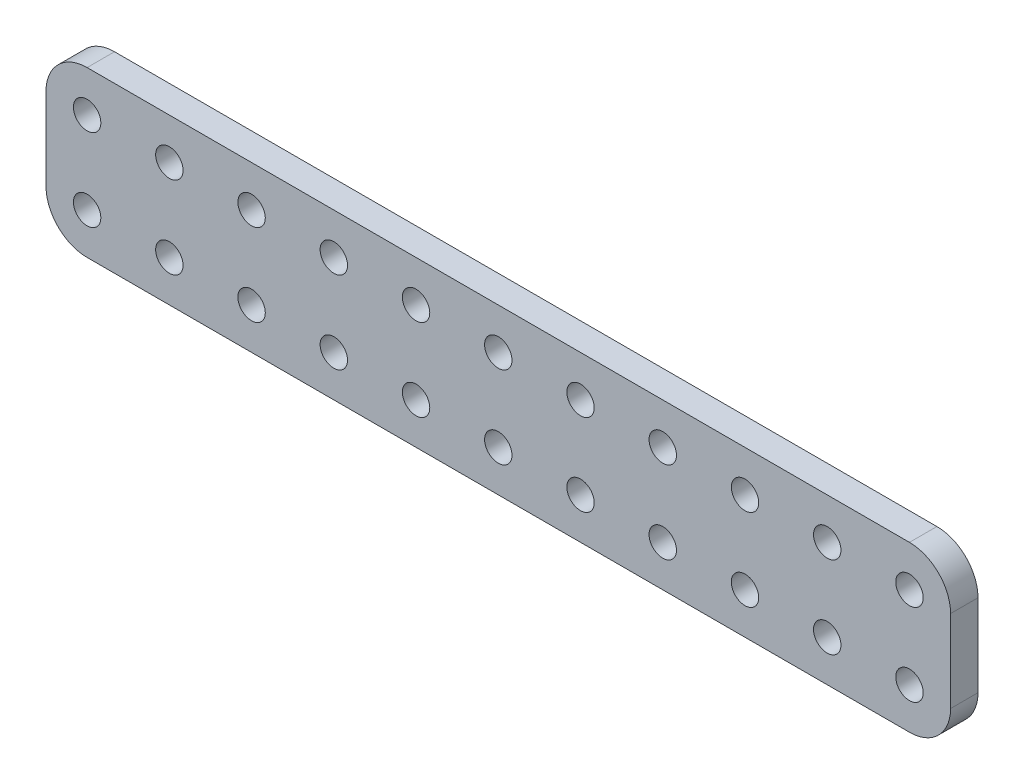
ISO-10303-21;
HEADER;
FILE_DESCRIPTION(('STEP AP214'),'2;1');
FILE_NAME('part.step','',(''),(''),'','','');
FILE_SCHEMA(('AUTOMOTIVE_DESIGN { 1 0 10303 214 1 1 1 1 }'));
ENDSEC;
DATA;
#1=APPLICATION_CONTEXT('core data for automotive mechanical design processes');
#2=APPLICATION_PROTOCOL_DEFINITION('international standard','automotive_design',2000,#1);
#3=PRODUCT_CONTEXT('',#1,'mechanical');
#4=PRODUCT('Part','Part','',(#3));
#5=PRODUCT_RELATED_PRODUCT_CATEGORY('part','',(#4));
#6=PRODUCT_DEFINITION_FORMATION('','',#4);
#7=PRODUCT_DEFINITION_CONTEXT('part definition',#1,'design');
#8=PRODUCT_DEFINITION('design','',#6,#7);
#9=PRODUCT_DEFINITION_SHAPE('','',#8);
#10=(LENGTH_UNIT() NAMED_UNIT(*) SI_UNIT(.MILLI.,.METRE.));
#11=(NAMED_UNIT(*) PLANE_ANGLE_UNIT() SI_UNIT($,.RADIAN.));
#12=(NAMED_UNIT(*) SI_UNIT($,.STERADIAN.) SOLID_ANGLE_UNIT());
#13=UNCERTAINTY_MEASURE_WITH_UNIT(LENGTH_MEASURE(1.E-05),#10,'distance_accuracy_value','');
#14=(GEOMETRIC_REPRESENTATION_CONTEXT(3) GLOBAL_UNCERTAINTY_ASSIGNED_CONTEXT((#13)) GLOBAL_UNIT_ASSIGNED_CONTEXT((#10,
#11,#12)) REPRESENTATION_CONTEXT('',''));
#15=CARTESIAN_POINT('',(0.,0.,0.));
#16=DIRECTION('',(0.,0.,1.));
#17=DIRECTION('',(1.,0.,0.));
#18=AXIS2_PLACEMENT_3D('',#15,#16,#17);
#19=CARTESIAN_POINT('',(346.4291313108,224.2422436139,3.));
#20=DIRECTION('',(0.,0.,1.));
#21=DIRECTION('',(1.,0.,0.));
#22=AXIS2_PLACEMENT_3D('',#19,#20,#21);
#23=PLANE('',#22);
#24=CARTESIAN_POINT('',(328.4291313108,224.2422436139,3.));
#25=DIRECTION('',(0.,0.,1.));
#26=DIRECTION('',(1.,0.,0.));
#27=AXIS2_PLACEMENT_3D('',#24,#25,#26);
#28=CIRCLE('',#27,1.5);
#29=CARTESIAN_POINT('',(329.9291313108,224.2422436139,3.));
#30=VERTEX_POINT('',#29);
#31=EDGE_CURVE('E296',#30,#30,#28,.T.);
#32=ORIENTED_EDGE('',*,*,#31,.F.);
#33=EDGE_LOOP('',(#32));
#34=FACE_BOUND('',#33,.T.);
#35=CARTESIAN_POINT('',(337.4291313108,224.2422436139,3.));
#36=DIRECTION('',(0.,0.,1.));
#37=DIRECTION('',(1.,0.,0.));
#38=AXIS2_PLACEMENT_3D('',#35,#36,#37);
#39=CIRCLE('',#38,1.5);
#40=CARTESIAN_POINT('',(338.9291313108,224.2422436139,3.));
#41=VERTEX_POINT('',#40);
#42=EDGE_CURVE('E284',#41,#41,#39,.T.);
#43=ORIENTED_EDGE('',*,*,#42,.F.);
#44=EDGE_LOOP('',(#43));
#45=FACE_BOUND('',#44,.T.);
#46=CARTESIAN_POINT('',(256.4291313108,224.2422436139,3.));
#47=DIRECTION('',(0.,0.,1.));
#48=DIRECTION('',(1.,0.,0.));
#49=AXIS2_PLACEMENT_3D('',#46,#47,#48);
#50=CIRCLE('',#49,1.50000000000006);
#51=CARTESIAN_POINT('',(257.9291313108,224.2422436139,3.));
#52=VERTEX_POINT('',#51);
#53=EDGE_CURVE('E272',#52,#52,#50,.T.);
#54=ORIENTED_EDGE('',*,*,#53,.F.);
#55=EDGE_LOOP('',(#54));
#56=FACE_BOUND('',#55,.T.);
#57=CARTESIAN_POINT('',(274.4291313108,224.2422436139,3.));
#58=DIRECTION('',(0.,0.,1.));
#59=DIRECTION('',(1.,0.,0.));
#60=AXIS2_PLACEMENT_3D('',#57,#58,#59);
#61=CIRCLE('',#60,1.5);
#62=CARTESIAN_POINT('',(275.9291313108,224.2422436139,3.));
#63=VERTEX_POINT('',#62);
#64=EDGE_CURVE('E260',#63,#63,#61,.T.);
#65=ORIENTED_EDGE('',*,*,#64,.F.);
#66=EDGE_LOOP('',(#65));
#67=FACE_BOUND('',#66,.T.);
#68=CARTESIAN_POINT('',(256.4291313108,215.2422436139,3.));
#69=DIRECTION('',(0.,0.,1.));
#70=DIRECTION('',(1.,0.,0.));
#71=AXIS2_PLACEMENT_3D('',#68,#69,#70);
#72=CIRCLE('',#71,1.49999999999983);
#73=CARTESIAN_POINT('',(257.9291313108,215.2422436139,3.));
#74=VERTEX_POINT('',#73);
#75=EDGE_CURVE('E248',#74,#74,#72,.T.);
#76=ORIENTED_EDGE('',*,*,#75,.F.);
#77=EDGE_LOOP('',(#76));
#78=FACE_BOUND('',#77,.T.);
#79=CARTESIAN_POINT('',(283.4291313108,215.2422436139,3.));
#80=DIRECTION('',(0.,0.,1.));
#81=DIRECTION('',(1.,0.,0.));
#82=AXIS2_PLACEMENT_3D('',#79,#80,#81);
#83=CIRCLE('',#82,1.5);
#84=CARTESIAN_POINT('',(284.9291313108,215.2422436139,3.));
#85=VERTEX_POINT('',#84);
#86=EDGE_CURVE('E236',#85,#85,#83,.T.);
#87=ORIENTED_EDGE('',*,*,#86,.F.);
#88=EDGE_LOOP('',(#87));
#89=FACE_BOUND('',#88,.T.);
#90=CARTESIAN_POINT('',(301.4291313108,215.2422436139,3.));
#91=DIRECTION('',(0.,0.,1.));
#92=DIRECTION('',(1.,0.,0.));
#93=AXIS2_PLACEMENT_3D('',#90,#91,#92);
#94=CIRCLE('',#93,1.5);
#95=CARTESIAN_POINT('',(302.9291313108,215.2422436139,3.));
#96=VERTEX_POINT('',#95);
#97=EDGE_CURVE('E224',#96,#96,#94,.T.);
#98=ORIENTED_EDGE('',*,*,#97,.F.);
#99=EDGE_LOOP('',(#98));
#100=FACE_BOUND('',#99,.T.);
#101=CARTESIAN_POINT('',(310.4291313108,215.2422436139,3.));
#102=DIRECTION('',(0.,0.,1.));
#103=DIRECTION('',(1.,0.,0.));
#104=AXIS2_PLACEMENT_3D('',#101,#102,#103);
#105=CIRCLE('',#104,1.5);
#106=CARTESIAN_POINT('',(311.9291313108,215.2422436139,3.));
#107=VERTEX_POINT('',#106);
#108=EDGE_CURVE('E212',#107,#107,#105,.T.);
#109=ORIENTED_EDGE('',*,*,#108,.F.);
#110=EDGE_LOOP('',(#109));
#111=FACE_BOUND('',#110,.T.);
#112=CARTESIAN_POINT('',(319.4291313108,215.2422436139,3.));
#113=DIRECTION('',(0.,0.,1.));
#114=DIRECTION('',(1.,0.,0.));
#115=AXIS2_PLACEMENT_3D('',#112,#113,#114);
#116=CIRCLE('',#115,1.5);
#117=CARTESIAN_POINT('',(320.9291313108,215.2422436139,3.));
#118=VERTEX_POINT('',#117);
#119=EDGE_CURVE('E200',#118,#118,#116,.T.);
#120=ORIENTED_EDGE('',*,*,#119,.F.);
#121=EDGE_LOOP('',(#120));
#122=FACE_BOUND('',#121,.T.);
#123=CARTESIAN_POINT('',(301.4291313108,224.2422436139,3.));
#124=DIRECTION('',(0.,0.,1.));
#125=DIRECTION('',(1.,0.,0.));
#126=AXIS2_PLACEMENT_3D('',#123,#124,#125);
#127=CIRCLE('',#126,1.5);
#128=CARTESIAN_POINT('',(302.9291313108,224.2422436139,3.));
#129=VERTEX_POINT('',#128);
#130=EDGE_CURVE('E188',#129,#129,#127,.T.);
#131=ORIENTED_EDGE('',*,*,#130,.F.);
#132=EDGE_LOOP('',(#131));
#133=FACE_BOUND('',#132,.T.);
#134=CARTESIAN_POINT('',(310.4291313108,224.2422436139,3.));
#135=DIRECTION('',(0.,0.,1.));
#136=DIRECTION('',(1.,0.,0.));
#137=AXIS2_PLACEMENT_3D('',#134,#135,#136);
#138=CIRCLE('',#137,1.5);
#139=CARTESIAN_POINT('',(311.9291313108,224.2422436139,3.));
#140=VERTEX_POINT('',#139);
#141=EDGE_CURVE('E134',#140,#140,#138,.T.);
#142=ORIENTED_EDGE('',*,*,#141,.F.);
#143=EDGE_LOOP('',(#142));
#144=FACE_BOUND('',#143,.T.);
#145=CARTESIAN_POINT('',(346.4291313108,224.2422436139,3.));
#146=DIRECTION('',(0.,0.,1.));
#147=DIRECTION('',(1.,0.,0.));
#148=AXIS2_PLACEMENT_3D('',#145,#146,#147);
#149=CIRCLE('',#148,4.5);
#150=CARTESIAN_POINT('',(350.9291313108,224.2422436139,3.));
#151=VERTEX_POINT('',#150);
#152=CARTESIAN_POINT('',(346.4291313108,228.7422436139,3.));
#153=VERTEX_POINT('',#152);
#154=EDGE_CURVE('E145',#151,#153,#149,.T.);
#155=ORIENTED_EDGE('',*,*,#154,.T.);
#156=DIRECTION('',(-1.,0.,0.));
#157=VECTOR('',#156,1.);
#158=CARTESIAN_POINT('',(256.4291313108,228.7422436139,3.));
#159=LINE('',#158,#157);
#160=CARTESIAN_POINT('',(256.4291313108,228.7422436139,3.));
#161=VERTEX_POINT('',#160);
#162=EDGE_CURVE('E93',#153,#161,#159,.T.);
#163=ORIENTED_EDGE('',*,*,#162,.T.);
#164=CARTESIAN_POINT('',(256.4291313108,224.2422436139,3.));
#165=DIRECTION('',(0.,0.,1.));
#166=DIRECTION('',(1.,0.,0.));
#167=AXIS2_PLACEMENT_3D('',#164,#165,#166);
#168=CIRCLE('',#167,4.5);
#169=CARTESIAN_POINT('',(251.9291313108,224.2422436139,3.));
#170=VERTEX_POINT('',#169);
#171=EDGE_CURVE('E160',#161,#170,#168,.T.);
#172=ORIENTED_EDGE('',*,*,#171,.T.);
#173=DIRECTION('',(0.,-1.,0.));
#174=VECTOR('',#173,1.);
#175=CARTESIAN_POINT('',(251.9291313108,224.2422436139,3.));
#176=LINE('',#175,#174);
#177=CARTESIAN_POINT('',(251.9291313108,215.2422436139,3.));
#178=VERTEX_POINT('',#177);
#179=EDGE_CURVE('E173',#170,#178,#176,.T.);
#180=ORIENTED_EDGE('',*,*,#179,.T.);
#181=CARTESIAN_POINT('',(256.4291313108,215.2422436139,3.));
#182=DIRECTION('',(0.,0.,1.));
#183=DIRECTION('',(1.,0.,0.));
#184=AXIS2_PLACEMENT_3D('',#181,#182,#183);
#185=CIRCLE('',#184,4.50000000000023);
#186=CARTESIAN_POINT('',(256.4291313108,210.7422436139,3.));
#187=VERTEX_POINT('',#186);
#188=EDGE_CURVE('E112',#178,#187,#185,.T.);
#189=ORIENTED_EDGE('',*,*,#188,.T.);
#190=DIRECTION('',(1.,0.,0.));
#191=VECTOR('',#190,1.);
#192=CARTESIAN_POINT('',(346.4291313108,210.7422436139,3.));
#193=LINE('',#192,#191);
#194=CARTESIAN_POINT('',(346.4291313108,210.7422436139,3.));
#195=VERTEX_POINT('',#194);
#196=EDGE_CURVE('E106',#187,#195,#193,.T.);
#197=ORIENTED_EDGE('',*,*,#196,.T.);
#198=CARTESIAN_POINT('',(346.4291313108,215.2422436139,3.));
#199=DIRECTION('',(0.,0.,1.));
#200=DIRECTION('',(1.,0.,0.));
#201=AXIS2_PLACEMENT_3D('',#198,#199,#200);
#202=CIRCLE('',#201,4.5);
#203=CARTESIAN_POINT('',(350.9291313108,215.2422436139,3.));
#204=VERTEX_POINT('',#203);
#205=EDGE_CURVE('E110',#195,#204,#202,.T.);
#206=ORIENTED_EDGE('',*,*,#205,.T.);
#207=DIRECTION('',(0.,1.,0.));
#208=VECTOR('',#207,1.);
#209=CARTESIAN_POINT('',(350.9291313108,224.2422436139,3.));
#210=LINE('',#209,#208);
#211=EDGE_CURVE('E50',#204,#151,#210,.T.);
#212=ORIENTED_EDGE('',*,*,#211,.T.);
#213=EDGE_LOOP('',(#155,#163,#172,#180,#189,#197,#206,#212));
#214=FACE_BOUND('',#213,.T.);
#215=CARTESIAN_POINT('',(292.4291313108,224.2422436139,3.));
#216=DIRECTION('',(0.,0.,1.));
#217=DIRECTION('',(1.,0.,0.));
#218=AXIS2_PLACEMENT_3D('',#215,#216,#217);
#219=CIRCLE('',#218,1.5);
#220=CARTESIAN_POINT('',(293.9291313108,224.2422436139,3.));
#221=VERTEX_POINT('',#220);
#222=EDGE_CURVE('E182',#221,#221,#219,.T.);
#223=ORIENTED_EDGE('',*,*,#222,.F.);
#224=EDGE_LOOP('',(#223));
#225=FACE_BOUND('',#224,.T.);
#226=CARTESIAN_POINT('',(337.4291313108,215.2422436139,3.));
#227=DIRECTION('',(0.,0.,1.));
#228=DIRECTION('',(1.,0.,0.));
#229=AXIS2_PLACEMENT_3D('',#226,#227,#228);
#230=CIRCLE('',#229,1.5);
#231=CARTESIAN_POINT('',(338.9291313108,215.2422436139,3.));
#232=VERTEX_POINT('',#231);
#233=EDGE_CURVE('E194',#232,#232,#230,.T.);
#234=ORIENTED_EDGE('',*,*,#233,.F.);
#235=EDGE_LOOP('',(#234));
#236=FACE_BOUND('',#235,.T.);
#237=CARTESIAN_POINT('',(328.4291313108,215.2422436139,3.));
#238=DIRECTION('',(0.,0.,1.));
#239=DIRECTION('',(1.,0.,0.));
#240=AXIS2_PLACEMENT_3D('',#237,#238,#239);
#241=CIRCLE('',#240,1.5);
#242=CARTESIAN_POINT('',(329.9291313108,215.2422436139,3.));
#243=VERTEX_POINT('',#242);
#244=EDGE_CURVE('E206',#243,#243,#241,.T.);
#245=ORIENTED_EDGE('',*,*,#244,.F.);
#246=EDGE_LOOP('',(#245));
#247=FACE_BOUND('',#246,.T.);
#248=CARTESIAN_POINT('',(292.4291313108,215.2422436139,3.));
#249=DIRECTION('',(0.,0.,1.));
#250=DIRECTION('',(1.,0.,0.));
#251=AXIS2_PLACEMENT_3D('',#248,#249,#250);
#252=CIRCLE('',#251,1.5);
#253=CARTESIAN_POINT('',(293.9291313108,215.2422436139,3.));
#254=VERTEX_POINT('',#253);
#255=EDGE_CURVE('E218',#254,#254,#252,.T.);
#256=ORIENTED_EDGE('',*,*,#255,.F.);
#257=EDGE_LOOP('',(#256));
#258=FACE_BOUND('',#257,.T.);
#259=CARTESIAN_POINT('',(274.4291313108,215.2422436139,3.));
#260=DIRECTION('',(0.,0.,1.));
#261=DIRECTION('',(1.,0.,0.));
#262=AXIS2_PLACEMENT_3D('',#259,#260,#261);
#263=CIRCLE('',#262,1.5);
#264=CARTESIAN_POINT('',(275.9291313108,215.2422436139,3.));
#265=VERTEX_POINT('',#264);
#266=EDGE_CURVE('E230',#265,#265,#263,.T.);
#267=ORIENTED_EDGE('',*,*,#266,.F.);
#268=EDGE_LOOP('',(#267));
#269=FACE_BOUND('',#268,.T.);
#270=CARTESIAN_POINT('',(265.4291313108,215.2422436139,3.));
#271=DIRECTION('',(0.,0.,1.));
#272=DIRECTION('',(1.,0.,0.));
#273=AXIS2_PLACEMENT_3D('',#270,#271,#272);
#274=CIRCLE('',#273,1.5);
#275=CARTESIAN_POINT('',(266.9291313108,215.2422436139,3.));
#276=VERTEX_POINT('',#275);
#277=EDGE_CURVE('E242',#276,#276,#274,.T.);
#278=ORIENTED_EDGE('',*,*,#277,.F.);
#279=EDGE_LOOP('',(#278));
#280=FACE_BOUND('',#279,.T.);
#281=CARTESIAN_POINT('',(346.4291313108,215.2422436139,3.));
#282=DIRECTION('',(0.,0.,1.));
#283=DIRECTION('',(1.,0.,0.));
#284=AXIS2_PLACEMENT_3D('',#281,#282,#283);
#285=CIRCLE('',#284,1.5);
#286=CARTESIAN_POINT('',(347.9291313108,215.2422436139,3.));
#287=VERTEX_POINT('',#286);
#288=EDGE_CURVE('E254',#287,#287,#285,.T.);
#289=ORIENTED_EDGE('',*,*,#288,.F.);
#290=EDGE_LOOP('',(#289));
#291=FACE_BOUND('',#290,.T.);
#292=CARTESIAN_POINT('',(265.4291313108,224.2422436139,3.));
#293=DIRECTION('',(0.,0.,1.));
#294=DIRECTION('',(1.,0.,0.));
#295=AXIS2_PLACEMENT_3D('',#292,#293,#294);
#296=CIRCLE('',#295,1.5);
#297=CARTESIAN_POINT('',(266.9291313108,224.2422436139,3.));
#298=VERTEX_POINT('',#297);
#299=EDGE_CURVE('E266',#298,#298,#296,.T.);
#300=ORIENTED_EDGE('',*,*,#299,.F.);
#301=EDGE_LOOP('',(#300));
#302=FACE_BOUND('',#301,.T.);
#303=CARTESIAN_POINT('',(283.4291313108,224.2422436139,3.));
#304=DIRECTION('',(0.,0.,1.));
#305=DIRECTION('',(1.,0.,0.));
#306=AXIS2_PLACEMENT_3D('',#303,#304,#305);
#307=CIRCLE('',#306,1.5);
#308=CARTESIAN_POINT('',(284.9291313108,224.2422436139,3.));
#309=VERTEX_POINT('',#308);
#310=EDGE_CURVE('E278',#309,#309,#307,.T.);
#311=ORIENTED_EDGE('',*,*,#310,.F.);
#312=EDGE_LOOP('',(#311));
#313=FACE_BOUND('',#312,.T.);
#314=CARTESIAN_POINT('',(319.4291313108,224.2422436139,3.));
#315=DIRECTION('',(0.,0.,1.));
#316=DIRECTION('',(1.,0.,0.));
#317=AXIS2_PLACEMENT_3D('',#314,#315,#316);
#318=CIRCLE('',#317,1.5);
#319=CARTESIAN_POINT('',(320.9291313108,224.2422436139,3.));
#320=VERTEX_POINT('',#319);
#321=EDGE_CURVE('E290',#320,#320,#318,.T.);
#322=ORIENTED_EDGE('',*,*,#321,.F.);
#323=EDGE_LOOP('',(#322));
#324=FACE_BOUND('',#323,.T.);
#325=CARTESIAN_POINT('',(346.4291313108,224.2422436139,3.));
#326=DIRECTION('',(0.,0.,1.));
#327=DIRECTION('',(1.,0.,0.));
#328=AXIS2_PLACEMENT_3D('',#325,#326,#327);
#329=CIRCLE('',#328,1.5);
#330=CARTESIAN_POINT('',(347.9291313108,224.2422436139,3.));
#331=VERTEX_POINT('',#330);
#332=EDGE_CURVE('E302',#331,#331,#329,.T.);
#333=ORIENTED_EDGE('',*,*,#332,.F.);
#334=EDGE_LOOP('',(#333));
#335=FACE_BOUND('',#334,.T.);
#336=ADVANCED_FACE('F33',(#34,#45,#56,#67,#78,#89,#100,#111,#122,#133,#144,#214,#225,#236,#247,
#258,#269,#280,#291,#302,#313,#324,#335),#23,.T.);
#337=CARTESIAN_POINT('',(346.4291313108,224.2422436139,0.));
#338=DIRECTION('',(0.,0.,1.));
#339=DIRECTION('',(1.,0.,0.));
#340=AXIS2_PLACEMENT_3D('',#337,#338,#339);
#341=PLANE('',#340);
#342=CARTESIAN_POINT('',(328.4291313108,224.2422436139,0.));
#343=DIRECTION('',(0.,0.,1.));
#344=DIRECTION('',(1.,0.,0.));
#345=AXIS2_PLACEMENT_3D('',#342,#343,#344);
#346=CIRCLE('',#345,1.5);
#347=CARTESIAN_POINT('',(329.9291313108,224.2422436139,0.));
#348=VERTEX_POINT('',#347);
#349=EDGE_CURVE('E299',#348,#348,#346,.T.);
#350=ORIENTED_EDGE('',*,*,#349,.T.);
#351=EDGE_LOOP('',(#350));
#352=FACE_BOUND('',#351,.T.);
#353=CARTESIAN_POINT('',(337.4291313108,224.2422436139,0.));
#354=DIRECTION('',(0.,0.,1.));
#355=DIRECTION('',(1.,0.,0.));
#356=AXIS2_PLACEMENT_3D('',#353,#354,#355);
#357=CIRCLE('',#356,1.5);
#358=CARTESIAN_POINT('',(338.9291313108,224.2422436139,0.));
#359=VERTEX_POINT('',#358);
#360=EDGE_CURVE('E287',#359,#359,#357,.T.);
#361=ORIENTED_EDGE('',*,*,#360,.T.);
#362=EDGE_LOOP('',(#361));
#363=FACE_BOUND('',#362,.T.);
#364=CARTESIAN_POINT('',(256.4291313108,224.2422436139,0.));
#365=DIRECTION('',(0.,0.,1.));
#366=DIRECTION('',(1.,0.,0.));
#367=AXIS2_PLACEMENT_3D('',#364,#365,#366);
#368=CIRCLE('',#367,1.50000000000006);
#369=CARTESIAN_POINT('',(257.9291313108,224.2422436139,0.));
#370=VERTEX_POINT('',#369);
#371=EDGE_CURVE('E275',#370,#370,#368,.T.);
#372=ORIENTED_EDGE('',*,*,#371,.T.);
#373=EDGE_LOOP('',(#372));
#374=FACE_BOUND('',#373,.T.);
#375=CARTESIAN_POINT('',(274.4291313108,224.2422436139,0.));
#376=DIRECTION('',(0.,0.,1.));
#377=DIRECTION('',(1.,0.,0.));
#378=AXIS2_PLACEMENT_3D('',#375,#376,#377);
#379=CIRCLE('',#378,1.5);
#380=CARTESIAN_POINT('',(275.9291313108,224.2422436139,0.));
#381=VERTEX_POINT('',#380);
#382=EDGE_CURVE('E263',#381,#381,#379,.T.);
#383=ORIENTED_EDGE('',*,*,#382,.T.);
#384=EDGE_LOOP('',(#383));
#385=FACE_BOUND('',#384,.T.);
#386=CARTESIAN_POINT('',(256.4291313108,215.2422436139,0.));
#387=DIRECTION('',(0.,0.,1.));
#388=DIRECTION('',(1.,0.,0.));
#389=AXIS2_PLACEMENT_3D('',#386,#387,#388);
#390=CIRCLE('',#389,1.49999999999983);
#391=CARTESIAN_POINT('',(257.9291313108,215.2422436139,0.));
#392=VERTEX_POINT('',#391);
#393=EDGE_CURVE('E251',#392,#392,#390,.T.);
#394=ORIENTED_EDGE('',*,*,#393,.T.);
#395=EDGE_LOOP('',(#394));
#396=FACE_BOUND('',#395,.T.);
#397=CARTESIAN_POINT('',(283.4291313108,215.2422436139,0.));
#398=DIRECTION('',(0.,0.,1.));
#399=DIRECTION('',(1.,0.,0.));
#400=AXIS2_PLACEMENT_3D('',#397,#398,#399);
#401=CIRCLE('',#400,1.5);
#402=CARTESIAN_POINT('',(284.9291313108,215.2422436139,0.));
#403=VERTEX_POINT('',#402);
#404=EDGE_CURVE('E239',#403,#403,#401,.T.);
#405=ORIENTED_EDGE('',*,*,#404,.T.);
#406=EDGE_LOOP('',(#405));
#407=FACE_BOUND('',#406,.T.);
#408=CARTESIAN_POINT('',(301.4291313108,215.2422436139,0.));
#409=DIRECTION('',(0.,0.,1.));
#410=DIRECTION('',(1.,0.,0.));
#411=AXIS2_PLACEMENT_3D('',#408,#409,#410);
#412=CIRCLE('',#411,1.5);
#413=CARTESIAN_POINT('',(302.9291313108,215.2422436139,0.));
#414=VERTEX_POINT('',#413);
#415=EDGE_CURVE('E227',#414,#414,#412,.T.);
#416=ORIENTED_EDGE('',*,*,#415,.T.);
#417=EDGE_LOOP('',(#416));
#418=FACE_BOUND('',#417,.T.);
#419=CARTESIAN_POINT('',(310.4291313108,215.2422436139,0.));
#420=DIRECTION('',(0.,0.,1.));
#421=DIRECTION('',(1.,0.,0.));
#422=AXIS2_PLACEMENT_3D('',#419,#420,#421);
#423=CIRCLE('',#422,1.5);
#424=CARTESIAN_POINT('',(311.9291313108,215.2422436139,0.));
#425=VERTEX_POINT('',#424);
#426=EDGE_CURVE('E215',#425,#425,#423,.T.);
#427=ORIENTED_EDGE('',*,*,#426,.T.);
#428=EDGE_LOOP('',(#427));
#429=FACE_BOUND('',#428,.T.);
#430=CARTESIAN_POINT('',(319.4291313108,215.2422436139,0.));
#431=DIRECTION('',(0.,0.,1.));
#432=DIRECTION('',(1.,0.,0.));
#433=AXIS2_PLACEMENT_3D('',#430,#431,#432);
#434=CIRCLE('',#433,1.5);
#435=CARTESIAN_POINT('',(320.9291313108,215.2422436139,0.));
#436=VERTEX_POINT('',#435);
#437=EDGE_CURVE('E203',#436,#436,#434,.T.);
#438=ORIENTED_EDGE('',*,*,#437,.T.);
#439=EDGE_LOOP('',(#438));
#440=FACE_BOUND('',#439,.T.);
#441=CARTESIAN_POINT('',(301.4291313108,224.2422436139,0.));
#442=DIRECTION('',(0.,0.,1.));
#443=DIRECTION('',(1.,0.,0.));
#444=AXIS2_PLACEMENT_3D('',#441,#442,#443);
#445=CIRCLE('',#444,1.5);
#446=CARTESIAN_POINT('',(302.9291313108,224.2422436139,0.));
#447=VERTEX_POINT('',#446);
#448=EDGE_CURVE('E191',#447,#447,#445,.T.);
#449=ORIENTED_EDGE('',*,*,#448,.T.);
#450=EDGE_LOOP('',(#449));
#451=FACE_BOUND('',#450,.T.);
#452=CARTESIAN_POINT('',(310.4291313108,224.2422436139,0.));
#453=DIRECTION('',(0.,0.,1.));
#454=DIRECTION('',(1.,0.,0.));
#455=AXIS2_PLACEMENT_3D('',#452,#453,#454);
#456=CIRCLE('',#455,1.5);
#457=CARTESIAN_POINT('',(311.9291313108,224.2422436139,0.));
#458=VERTEX_POINT('',#457);
#459=EDGE_CURVE('E179',#458,#458,#456,.T.);
#460=ORIENTED_EDGE('',*,*,#459,.T.);
#461=EDGE_LOOP('',(#460));
#462=FACE_BOUND('',#461,.T.);
#463=CARTESIAN_POINT('',(346.4291313108,224.2422436139,0.));
#464=DIRECTION('',(0.,0.,1.));
#465=DIRECTION('',(1.,0.,0.));
#466=AXIS2_PLACEMENT_3D('',#463,#464,#465);
#467=CIRCLE('',#466,4.5);
#468=CARTESIAN_POINT('',(350.9291313108,224.2422436139,0.));
#469=VERTEX_POINT('',#468);
#470=CARTESIAN_POINT('',(346.4291313108,228.7422436139,0.));
#471=VERTEX_POINT('',#470);
#472=EDGE_CURVE('E130',#469,#471,#467,.T.);
#473=ORIENTED_EDGE('',*,*,#472,.F.);
#474=DIRECTION('',(0.,1.,0.));
#475=VECTOR('',#474,1.);
#476=CARTESIAN_POINT('',(350.9291313108,224.2422436139,0.));
#477=LINE('',#476,#475);
#478=CARTESIAN_POINT('',(350.9291313108,215.2422436139,0.));
#479=VERTEX_POINT('',#478);
#480=EDGE_CURVE('E85',#479,#469,#477,.T.);
#481=ORIENTED_EDGE('',*,*,#480,.F.);
#482=CARTESIAN_POINT('',(346.4291313108,215.2422436139,0.));
#483=DIRECTION('',(0.,0.,1.));
#484=DIRECTION('',(1.,0.,0.));
#485=AXIS2_PLACEMENT_3D('',#482,#483,#484);
#486=CIRCLE('',#485,4.5);
#487=CARTESIAN_POINT('',(346.4291313108,210.7422436139,0.));
#488=VERTEX_POINT('',#487);
#489=EDGE_CURVE('E79',#488,#479,#486,.T.);
#490=ORIENTED_EDGE('',*,*,#489,.F.);
#491=DIRECTION('',(1.,0.,0.));
#492=VECTOR('',#491,1.);
#493=CARTESIAN_POINT('',(346.4291313108,210.7422436139,0.));
#494=LINE('',#493,#492);
#495=CARTESIAN_POINT('',(256.4291313108,210.7422436139,0.));
#496=VERTEX_POINT('',#495);
#497=EDGE_CURVE('E120',#496,#488,#494,.T.);
#498=ORIENTED_EDGE('',*,*,#497,.F.);
#499=CARTESIAN_POINT('',(256.4291313108,215.2422436139,0.));
#500=DIRECTION('',(0.,0.,1.));
#501=DIRECTION('',(1.,0.,0.));
#502=AXIS2_PLACEMENT_3D('',#499,#500,#501);
#503=CIRCLE('',#502,4.50000000000023);
#504=CARTESIAN_POINT('',(251.9291313108,215.2422436139,0.));
#505=VERTEX_POINT('',#504);
#506=EDGE_CURVE('E140',#505,#496,#503,.T.);
#507=ORIENTED_EDGE('',*,*,#506,.F.);
#508=DIRECTION('',(0.,-1.,0.));
#509=VECTOR('',#508,1.);
#510=CARTESIAN_POINT('',(251.9291313108,224.2422436139,0.));
#511=LINE('',#510,#509);
#512=CARTESIAN_POINT('',(251.9291313108,224.2422436139,0.));
#513=VERTEX_POINT('',#512);
#514=EDGE_CURVE('E138',#513,#505,#511,.T.);
#515=ORIENTED_EDGE('',*,*,#514,.F.);
#516=CARTESIAN_POINT('',(256.4291313108,224.2422436139,0.));
#517=DIRECTION('',(0.,0.,1.));
#518=DIRECTION('',(1.,0.,0.));
#519=AXIS2_PLACEMENT_3D('',#516,#517,#518);
#520=CIRCLE('',#519,4.5);
#521=CARTESIAN_POINT('',(256.4291313108,228.7422436139,0.));
#522=VERTEX_POINT('',#521);
#523=EDGE_CURVE('E136',#522,#513,#520,.T.);
#524=ORIENTED_EDGE('',*,*,#523,.F.);
#525=DIRECTION('',(-1.,0.,0.));
#526=VECTOR('',#525,1.);
#527=CARTESIAN_POINT('',(256.4291313108,228.7422436139,0.));
#528=LINE('',#527,#526);
#529=EDGE_CURVE('E133',#471,#522,#528,.T.);
#530=ORIENTED_EDGE('',*,*,#529,.F.);
#531=EDGE_LOOP('',(#473,#481,#490,#498,#507,#515,#524,#530));
#532=FACE_BOUND('',#531,.T.);
#533=CARTESIAN_POINT('',(292.4291313108,224.2422436139,0.));
#534=DIRECTION('',(0.,0.,1.));
#535=DIRECTION('',(1.,0.,0.));
#536=AXIS2_PLACEMENT_3D('',#533,#534,#535);
#537=CIRCLE('',#536,1.5);
#538=CARTESIAN_POINT('',(293.9291313108,224.2422436139,0.));
#539=VERTEX_POINT('',#538);
#540=EDGE_CURVE('E185',#539,#539,#537,.T.);
#541=ORIENTED_EDGE('',*,*,#540,.T.);
#542=EDGE_LOOP('',(#541));
#543=FACE_BOUND('',#542,.T.);
#544=CARTESIAN_POINT('',(337.4291313108,215.2422436139,0.));
#545=DIRECTION('',(0.,0.,1.));
#546=DIRECTION('',(1.,0.,0.));
#547=AXIS2_PLACEMENT_3D('',#544,#545,#546);
#548=CIRCLE('',#547,1.5);
#549=CARTESIAN_POINT('',(338.9291313108,215.2422436139,0.));
#550=VERTEX_POINT('',#549);
#551=EDGE_CURVE('E197',#550,#550,#548,.T.);
#552=ORIENTED_EDGE('',*,*,#551,.T.);
#553=EDGE_LOOP('',(#552));
#554=FACE_BOUND('',#553,.T.);
#555=CARTESIAN_POINT('',(328.4291313108,215.2422436139,0.));
#556=DIRECTION('',(0.,0.,1.));
#557=DIRECTION('',(1.,0.,0.));
#558=AXIS2_PLACEMENT_3D('',#555,#556,#557);
#559=CIRCLE('',#558,1.5);
#560=CARTESIAN_POINT('',(329.9291313108,215.2422436139,0.));
#561=VERTEX_POINT('',#560);
#562=EDGE_CURVE('E209',#561,#561,#559,.T.);
#563=ORIENTED_EDGE('',*,*,#562,.T.);
#564=EDGE_LOOP('',(#563));
#565=FACE_BOUND('',#564,.T.);
#566=CARTESIAN_POINT('',(292.4291313108,215.2422436139,0.));
#567=DIRECTION('',(0.,0.,1.));
#568=DIRECTION('',(1.,0.,0.));
#569=AXIS2_PLACEMENT_3D('',#566,#567,#568);
#570=CIRCLE('',#569,1.5);
#571=CARTESIAN_POINT('',(293.9291313108,215.2422436139,0.));
#572=VERTEX_POINT('',#571);
#573=EDGE_CURVE('E221',#572,#572,#570,.T.);
#574=ORIENTED_EDGE('',*,*,#573,.T.);
#575=EDGE_LOOP('',(#574));
#576=FACE_BOUND('',#575,.T.);
#577=CARTESIAN_POINT('',(274.4291313108,215.2422436139,0.));
#578=DIRECTION('',(0.,0.,1.));
#579=DIRECTION('',(1.,0.,0.));
#580=AXIS2_PLACEMENT_3D('',#577,#578,#579);
#581=CIRCLE('',#580,1.5);
#582=CARTESIAN_POINT('',(275.9291313108,215.2422436139,0.));
#583=VERTEX_POINT('',#582);
#584=EDGE_CURVE('E233',#583,#583,#581,.T.);
#585=ORIENTED_EDGE('',*,*,#584,.T.);
#586=EDGE_LOOP('',(#585));
#587=FACE_BOUND('',#586,.T.);
#588=CARTESIAN_POINT('',(265.4291313108,215.2422436139,0.));
#589=DIRECTION('',(0.,0.,1.));
#590=DIRECTION('',(1.,0.,0.));
#591=AXIS2_PLACEMENT_3D('',#588,#589,#590);
#592=CIRCLE('',#591,1.5);
#593=CARTESIAN_POINT('',(266.9291313108,215.2422436139,0.));
#594=VERTEX_POINT('',#593);
#595=EDGE_CURVE('E245',#594,#594,#592,.T.);
#596=ORIENTED_EDGE('',*,*,#595,.T.);
#597=EDGE_LOOP('',(#596));
#598=FACE_BOUND('',#597,.T.);
#599=CARTESIAN_POINT('',(346.4291313108,215.2422436139,0.));
#600=DIRECTION('',(0.,0.,1.));
#601=DIRECTION('',(1.,0.,0.));
#602=AXIS2_PLACEMENT_3D('',#599,#600,#601);
#603=CIRCLE('',#602,1.5);
#604=CARTESIAN_POINT('',(347.9291313108,215.2422436139,0.));
#605=VERTEX_POINT('',#604);
#606=EDGE_CURVE('E257',#605,#605,#603,.T.);
#607=ORIENTED_EDGE('',*,*,#606,.T.);
#608=EDGE_LOOP('',(#607));
#609=FACE_BOUND('',#608,.T.);
#610=CARTESIAN_POINT('',(265.4291313108,224.2422436139,0.));
#611=DIRECTION('',(0.,0.,1.));
#612=DIRECTION('',(1.,0.,0.));
#613=AXIS2_PLACEMENT_3D('',#610,#611,#612);
#614=CIRCLE('',#613,1.5);
#615=CARTESIAN_POINT('',(266.9291313108,224.2422436139,0.));
#616=VERTEX_POINT('',#615);
#617=EDGE_CURVE('E269',#616,#616,#614,.T.);
#618=ORIENTED_EDGE('',*,*,#617,.T.);
#619=EDGE_LOOP('',(#618));
#620=FACE_BOUND('',#619,.T.);
#621=CARTESIAN_POINT('',(283.4291313108,224.2422436139,0.));
#622=DIRECTION('',(0.,0.,1.));
#623=DIRECTION('',(1.,0.,0.));
#624=AXIS2_PLACEMENT_3D('',#621,#622,#623);
#625=CIRCLE('',#624,1.5);
#626=CARTESIAN_POINT('',(284.9291313108,224.2422436139,0.));
#627=VERTEX_POINT('',#626);
#628=EDGE_CURVE('E281',#627,#627,#625,.T.);
#629=ORIENTED_EDGE('',*,*,#628,.T.);
#630=EDGE_LOOP('',(#629));
#631=FACE_BOUND('',#630,.T.);
#632=CARTESIAN_POINT('',(319.4291313108,224.2422436139,0.));
#633=DIRECTION('',(0.,0.,1.));
#634=DIRECTION('',(1.,0.,0.));
#635=AXIS2_PLACEMENT_3D('',#632,#633,#634);
#636=CIRCLE('',#635,1.5);
#637=CARTESIAN_POINT('',(320.9291313108,224.2422436139,0.));
#638=VERTEX_POINT('',#637);
#639=EDGE_CURVE('E293',#638,#638,#636,.T.);
#640=ORIENTED_EDGE('',*,*,#639,.T.);
#641=EDGE_LOOP('',(#640));
#642=FACE_BOUND('',#641,.T.);
#643=CARTESIAN_POINT('',(346.4291313108,224.2422436139,0.));
#644=DIRECTION('',(0.,0.,1.));
#645=DIRECTION('',(1.,0.,0.));
#646=AXIS2_PLACEMENT_3D('',#643,#644,#645);
#647=CIRCLE('',#646,1.5);
#648=CARTESIAN_POINT('',(347.9291313108,224.2422436139,0.));
#649=VERTEX_POINT('',#648);
#650=EDGE_CURVE('E305',#649,#649,#647,.T.);
#651=ORIENTED_EDGE('',*,*,#650,.T.);
#652=EDGE_LOOP('',(#651));
#653=FACE_BOUND('',#652,.T.);
#654=ADVANCED_FACE('F164',(#352,#363,#374,#385,#396,#407,#418,#429,#440,#451,#462,#532,#543,
#554,#565,#576,#587,#598,#609,#620,#631,#642,#653),#341,.F.);
#655=CARTESIAN_POINT('',(346.4291313108,224.2422436139,3.));
#656=DIRECTION('',(0.,0.,-1.));
#657=DIRECTION('',(-1.,0.,0.));
#658=AXIS2_PLACEMENT_3D('',#655,#656,#657);
#659=CYLINDRICAL_SURFACE('',#658,4.5);
#660=ORIENTED_EDGE('',*,*,#472,.T.);
#661=DIRECTION('',(0.,0.,-1.));
#662=VECTOR('',#661,1.);
#663=CARTESIAN_POINT('',(346.4291313108,228.7422436139,3.));
#664=LINE('',#663,#662);
#665=EDGE_CURVE('E11',#153,#471,#664,.T.);
#666=ORIENTED_EDGE('',*,*,#665,.F.);
#667=ORIENTED_EDGE('',*,*,#154,.F.);
#668=DIRECTION('',(0.,0.,-1.));
#669=VECTOR('',#668,1.);
#670=CARTESIAN_POINT('',(350.9291313108,224.2422436139,3.));
#671=LINE('',#670,#669);
#672=EDGE_CURVE('E126',#151,#469,#671,.T.);
#673=ORIENTED_EDGE('',*,*,#672,.T.);
#674=EDGE_LOOP('',(#660,#666,#667,#673));
#675=FACE_BOUND('',#674,.T.);
#676=ADVANCED_FACE('F35',(#675),#659,.T.);
#677=CARTESIAN_POINT('',(256.4291313108,228.7422436139,3.));
#678=DIRECTION('',(0.,-1.,0.));
#679=DIRECTION('',(0.,0.,-1.));
#680=AXIS2_PLACEMENT_3D('',#677,#678,#679);
#681=PLANE('',#680);
#682=ORIENTED_EDGE('',*,*,#529,.T.);
#683=DIRECTION('',(0.,0.,-1.));
#684=VECTOR('',#683,1.);
#685=CARTESIAN_POINT('',(256.4291313108,228.7422436139,3.));
#686=LINE('',#685,#684);
#687=EDGE_CURVE('E42',#161,#522,#686,.T.);
#688=ORIENTED_EDGE('',*,*,#687,.F.);
#689=ORIENTED_EDGE('',*,*,#162,.F.);
#690=ORIENTED_EDGE('',*,*,#665,.T.);
#691=EDGE_LOOP('',(#682,#688,#689,#690));
#692=FACE_BOUND('',#691,.T.);
#693=ADVANCED_FACE('F340',(#692),#681,.F.);
#694=CARTESIAN_POINT('',(256.4291313108,224.2422436139,3.));
#695=DIRECTION('',(0.,0.,-1.));
#696=DIRECTION('',(-1.,0.,0.));
#697=AXIS2_PLACEMENT_3D('',#694,#695,#696);
#698=CYLINDRICAL_SURFACE('',#697,4.5);
#699=ORIENTED_EDGE('',*,*,#523,.T.);
#700=DIRECTION('',(0.,0.,-1.));
#701=VECTOR('',#700,1.);
#702=CARTESIAN_POINT('',(251.9291313108,224.2422436139,3.));
#703=LINE('',#702,#701);
#704=EDGE_CURVE('E152',#170,#513,#703,.T.);
#705=ORIENTED_EDGE('',*,*,#704,.F.);
#706=ORIENTED_EDGE('',*,*,#171,.F.);
#707=ORIENTED_EDGE('',*,*,#687,.T.);
#708=EDGE_LOOP('',(#699,#705,#706,#707));
#709=FACE_BOUND('',#708,.T.);
#710=ADVANCED_FACE('F158',(#709),#698,.T.);
#711=CARTESIAN_POINT('',(251.9291313108,224.2422436139,3.));
#712=DIRECTION('',(1.,0.,0.));
#713=DIRECTION('',(0.,0.,-1.));
#714=AXIS2_PLACEMENT_3D('',#711,#712,#713);
#715=PLANE('',#714);
#716=ORIENTED_EDGE('',*,*,#514,.T.);
#717=DIRECTION('',(0.,0.,-1.));
#718=VECTOR('',#717,1.);
#719=CARTESIAN_POINT('',(251.9291313108,215.2422436139,3.));
#720=LINE('',#719,#718);
#721=EDGE_CURVE('E149',#178,#505,#720,.T.);
#722=ORIENTED_EDGE('',*,*,#721,.F.);
#723=ORIENTED_EDGE('',*,*,#179,.F.);
#724=ORIENTED_EDGE('',*,*,#704,.T.);
#725=EDGE_LOOP('',(#716,#722,#723,#724));
#726=FACE_BOUND('',#725,.T.);
#727=ADVANCED_FACE('F169',(#726),#715,.F.);
#728=CARTESIAN_POINT('',(256.4291313108,215.2422436139,3.));
#729=DIRECTION('',(0.,0.,-1.));
#730=DIRECTION('',(-1.,0.,0.));
#731=AXIS2_PLACEMENT_3D('',#728,#729,#730);
#732=CYLINDRICAL_SURFACE('',#731,4.50000000000023);
#733=ORIENTED_EDGE('',*,*,#506,.T.);
#734=DIRECTION('',(0.,0.,-1.));
#735=VECTOR('',#734,1.);
#736=CARTESIAN_POINT('',(256.4291313108,210.7422436139,3.));
#737=LINE('',#736,#735);
#738=EDGE_CURVE('E121',#187,#496,#737,.T.);
#739=ORIENTED_EDGE('',*,*,#738,.F.);
#740=ORIENTED_EDGE('',*,*,#188,.F.);
#741=ORIENTED_EDGE('',*,*,#721,.T.);
#742=EDGE_LOOP('',(#733,#739,#740,#741));
#743=FACE_BOUND('',#742,.T.);
#744=ADVANCED_FACE('F172',(#743),#732,.T.);
#745=CARTESIAN_POINT('',(346.4291313108,210.7422436139,3.));
#746=DIRECTION('',(0.,1.,0.));
#747=DIRECTION('',(0.,0.,1.));
#748=AXIS2_PLACEMENT_3D('',#745,#746,#747);
#749=PLANE('',#748);
#750=ORIENTED_EDGE('',*,*,#497,.T.);
#751=DIRECTION('',(0.,0.,-1.));
#752=VECTOR('',#751,1.);
#753=CARTESIAN_POINT('',(346.4291313108,210.7422436139,3.));
#754=LINE('',#753,#752);
#755=EDGE_CURVE('E117',#195,#488,#754,.T.);
#756=ORIENTED_EDGE('',*,*,#755,.F.);
#757=ORIENTED_EDGE('',*,*,#196,.F.);
#758=ORIENTED_EDGE('',*,*,#738,.T.);
#759=EDGE_LOOP('',(#750,#756,#757,#758));
#760=FACE_BOUND('',#759,.T.);
#761=ADVANCED_FACE('F118',(#760),#749,.F.);
#762=CARTESIAN_POINT('',(346.4291313108,215.2422436139,3.));
#763=DIRECTION('',(0.,0.,-1.));
#764=DIRECTION('',(-1.,0.,0.));
#765=AXIS2_PLACEMENT_3D('',#762,#763,#764);
#766=CYLINDRICAL_SURFACE('',#765,4.5);
#767=ORIENTED_EDGE('',*,*,#489,.T.);
#768=DIRECTION('',(0.,0.,-1.));
#769=VECTOR('',#768,1.);
#770=CARTESIAN_POINT('',(350.9291313108,215.2422436139,3.));
#771=LINE('',#770,#769);
#772=EDGE_CURVE('E122',#204,#479,#771,.T.);
#773=ORIENTED_EDGE('',*,*,#772,.F.);
#774=ORIENTED_EDGE('',*,*,#205,.F.);
#775=ORIENTED_EDGE('',*,*,#755,.T.);
#776=EDGE_LOOP('',(#767,#773,#774,#775));
#777=FACE_BOUND('',#776,.T.);
#778=ADVANCED_FACE('F124',(#777),#766,.T.);
#779=CARTESIAN_POINT('',(350.9291313108,224.2422436139,3.));
#780=DIRECTION('',(-1.,0.,0.));
#781=DIRECTION('',(0.,0.,1.));
#782=AXIS2_PLACEMENT_3D('',#779,#780,#781);
#783=PLANE('',#782);
#784=ORIENTED_EDGE('',*,*,#480,.T.);
#785=ORIENTED_EDGE('',*,*,#672,.F.);
#786=ORIENTED_EDGE('',*,*,#211,.F.);
#787=ORIENTED_EDGE('',*,*,#772,.T.);
#788=EDGE_LOOP('',(#784,#785,#786,#787));
#789=FACE_BOUND('',#788,.T.);
#790=ADVANCED_FACE('F328',(#789),#783,.F.);
#791=CARTESIAN_POINT('',(310.4291313108,224.2422436139,3.));
#792=DIRECTION('',(0.,0.,-1.));
#793=DIRECTION('',(-1.,0.,0.));
#794=AXIS2_PLACEMENT_3D('',#791,#792,#793);
#795=CYLINDRICAL_SURFACE('',#794,1.5);
#796=ORIENTED_EDGE('',*,*,#141,.T.);
#797=EDGE_LOOP('',(#796));
#798=FACE_BOUND('',#797,.T.);
#799=ORIENTED_EDGE('',*,*,#459,.F.);
#800=EDGE_LOOP('',(#799));
#801=FACE_BOUND('',#800,.T.);
#802=ADVANCED_FACE('F325',(#798,#801),#795,.F.);
#803=CARTESIAN_POINT('',(292.4291313108,224.2422436139,3.));
#804=DIRECTION('',(0.,0.,-1.));
#805=DIRECTION('',(-1.,0.,0.));
#806=AXIS2_PLACEMENT_3D('',#803,#804,#805);
#807=CYLINDRICAL_SURFACE('',#806,1.5);
#808=ORIENTED_EDGE('',*,*,#222,.T.);
#809=EDGE_LOOP('',(#808));
#810=FACE_BOUND('',#809,.T.);
#811=ORIENTED_EDGE('',*,*,#540,.F.);
#812=EDGE_LOOP('',(#811));
#813=FACE_BOUND('',#812,.T.);
#814=ADVANCED_FACE('F404',(#810,#813),#807,.F.);
#815=CARTESIAN_POINT('',(301.4291313108,224.2422436139,3.));
#816=DIRECTION('',(0.,0.,-1.));
#817=DIRECTION('',(-1.,0.,0.));
#818=AXIS2_PLACEMENT_3D('',#815,#816,#817);
#819=CYLINDRICAL_SURFACE('',#818,1.5);
#820=ORIENTED_EDGE('',*,*,#130,.T.);
#821=EDGE_LOOP('',(#820));
#822=FACE_BOUND('',#821,.T.);
#823=ORIENTED_EDGE('',*,*,#448,.F.);
#824=EDGE_LOOP('',(#823));
#825=FACE_BOUND('',#824,.T.);
#826=ADVANCED_FACE('F412',(#822,#825),#819,.F.);
#827=CARTESIAN_POINT('',(337.4291313108,215.2422436139,3.));
#828=DIRECTION('',(0.,0.,-1.));
#829=DIRECTION('',(-1.,0.,0.));
#830=AXIS2_PLACEMENT_3D('',#827,#828,#829);
#831=CYLINDRICAL_SURFACE('',#830,1.5);
#832=ORIENTED_EDGE('',*,*,#233,.T.);
#833=EDGE_LOOP('',(#832));
#834=FACE_BOUND('',#833,.T.);
#835=ORIENTED_EDGE('',*,*,#551,.F.);
#836=EDGE_LOOP('',(#835));
#837=FACE_BOUND('',#836,.T.);
#838=ADVANCED_FACE('F420',(#834,#837),#831,.F.);
#839=CARTESIAN_POINT('',(319.4291313108,215.2422436139,3.));
#840=DIRECTION('',(0.,0.,-1.));
#841=DIRECTION('',(-1.,0.,0.));
#842=AXIS2_PLACEMENT_3D('',#839,#840,#841);
#843=CYLINDRICAL_SURFACE('',#842,1.5);
#844=ORIENTED_EDGE('',*,*,#119,.T.);
#845=EDGE_LOOP('',(#844));
#846=FACE_BOUND('',#845,.T.);
#847=ORIENTED_EDGE('',*,*,#437,.F.);
#848=EDGE_LOOP('',(#847));
#849=FACE_BOUND('',#848,.T.);
#850=ADVANCED_FACE('F429',(#846,#849),#843,.F.);
#851=CARTESIAN_POINT('',(328.4291313108,215.2422436139,3.));
#852=DIRECTION('',(0.,0.,-1.));
#853=DIRECTION('',(-1.,0.,0.));
#854=AXIS2_PLACEMENT_3D('',#851,#852,#853);
#855=CYLINDRICAL_SURFACE('',#854,1.5);
#856=ORIENTED_EDGE('',*,*,#244,.T.);
#857=EDGE_LOOP('',(#856));
#858=FACE_BOUND('',#857,.T.);
#859=ORIENTED_EDGE('',*,*,#562,.F.);
#860=EDGE_LOOP('',(#859));
#861=FACE_BOUND('',#860,.T.);
#862=ADVANCED_FACE('F438',(#858,#861),#855,.F.);
#863=CARTESIAN_POINT('',(310.4291313108,215.2422436139,3.));
#864=DIRECTION('',(0.,0.,-1.));
#865=DIRECTION('',(-1.,0.,0.));
#866=AXIS2_PLACEMENT_3D('',#863,#864,#865);
#867=CYLINDRICAL_SURFACE('',#866,1.5);
#868=ORIENTED_EDGE('',*,*,#108,.T.);
#869=EDGE_LOOP('',(#868));
#870=FACE_BOUND('',#869,.T.);
#871=ORIENTED_EDGE('',*,*,#426,.F.);
#872=EDGE_LOOP('',(#871));
#873=FACE_BOUND('',#872,.T.);
#874=ADVANCED_FACE('F447',(#870,#873),#867,.F.);
#875=CARTESIAN_POINT('',(292.4291313108,215.2422436139,3.));
#876=DIRECTION('',(0.,0.,-1.));
#877=DIRECTION('',(-1.,0.,0.));
#878=AXIS2_PLACEMENT_3D('',#875,#876,#877);
#879=CYLINDRICAL_SURFACE('',#878,1.5);
#880=ORIENTED_EDGE('',*,*,#255,.T.);
#881=EDGE_LOOP('',(#880));
#882=FACE_BOUND('',#881,.T.);
#883=ORIENTED_EDGE('',*,*,#573,.F.);
#884=EDGE_LOOP('',(#883));
#885=FACE_BOUND('',#884,.T.);
#886=ADVANCED_FACE('F456',(#882,#885),#879,.F.);
#887=CARTESIAN_POINT('',(301.4291313108,215.2422436139,3.));
#888=DIRECTION('',(0.,0.,-1.));
#889=DIRECTION('',(-1.,0.,0.));
#890=AXIS2_PLACEMENT_3D('',#887,#888,#889);
#891=CYLINDRICAL_SURFACE('',#890,1.5);
#892=ORIENTED_EDGE('',*,*,#97,.T.);
#893=EDGE_LOOP('',(#892));
#894=FACE_BOUND('',#893,.T.);
#895=ORIENTED_EDGE('',*,*,#415,.F.);
#896=EDGE_LOOP('',(#895));
#897=FACE_BOUND('',#896,.T.);
#898=ADVANCED_FACE('F465',(#894,#897),#891,.F.);
#899=CARTESIAN_POINT('',(274.4291313108,215.2422436139,3.));
#900=DIRECTION('',(0.,0.,-1.));
#901=DIRECTION('',(-1.,0.,0.));
#902=AXIS2_PLACEMENT_3D('',#899,#900,#901);
#903=CYLINDRICAL_SURFACE('',#902,1.5);
#904=ORIENTED_EDGE('',*,*,#266,.T.);
#905=EDGE_LOOP('',(#904));
#906=FACE_BOUND('',#905,.T.);
#907=ORIENTED_EDGE('',*,*,#584,.F.);
#908=EDGE_LOOP('',(#907));
#909=FACE_BOUND('',#908,.T.);
#910=ADVANCED_FACE('F474',(#906,#909),#903,.F.);
#911=CARTESIAN_POINT('',(283.4291313108,215.2422436139,3.));
#912=DIRECTION('',(0.,0.,-1.));
#913=DIRECTION('',(-1.,0.,0.));
#914=AXIS2_PLACEMENT_3D('',#911,#912,#913);
#915=CYLINDRICAL_SURFACE('',#914,1.5);
#916=ORIENTED_EDGE('',*,*,#86,.T.);
#917=EDGE_LOOP('',(#916));
#918=FACE_BOUND('',#917,.T.);
#919=ORIENTED_EDGE('',*,*,#404,.F.);
#920=EDGE_LOOP('',(#919));
#921=FACE_BOUND('',#920,.T.);
#922=ADVANCED_FACE('F483',(#918,#921),#915,.F.);
#923=CARTESIAN_POINT('',(265.4291313108,215.2422436139,3.));
#924=DIRECTION('',(0.,0.,-1.));
#925=DIRECTION('',(-1.,0.,0.));
#926=AXIS2_PLACEMENT_3D('',#923,#924,#925);
#927=CYLINDRICAL_SURFACE('',#926,1.5);
#928=ORIENTED_EDGE('',*,*,#277,.T.);
#929=EDGE_LOOP('',(#928));
#930=FACE_BOUND('',#929,.T.);
#931=ORIENTED_EDGE('',*,*,#595,.F.);
#932=EDGE_LOOP('',(#931));
#933=FACE_BOUND('',#932,.T.);
#934=ADVANCED_FACE('F492',(#930,#933),#927,.F.);
#935=CARTESIAN_POINT('',(256.4291313108,215.2422436139,3.));
#936=DIRECTION('',(0.,0.,-1.));
#937=DIRECTION('',(-1.,0.,0.));
#938=AXIS2_PLACEMENT_3D('',#935,#936,#937);
#939=CYLINDRICAL_SURFACE('',#938,1.49999999999983);
#940=ORIENTED_EDGE('',*,*,#75,.T.);
#941=EDGE_LOOP('',(#940));
#942=FACE_BOUND('',#941,.T.);
#943=ORIENTED_EDGE('',*,*,#393,.F.);
#944=EDGE_LOOP('',(#943));
#945=FACE_BOUND('',#944,.T.);
#946=ADVANCED_FACE('F501',(#942,#945),#939,.F.);
#947=CARTESIAN_POINT('',(346.4291313108,215.2422436139,3.));
#948=DIRECTION('',(0.,0.,-1.));
#949=DIRECTION('',(-1.,0.,0.));
#950=AXIS2_PLACEMENT_3D('',#947,#948,#949);
#951=CYLINDRICAL_SURFACE('',#950,1.5);
#952=ORIENTED_EDGE('',*,*,#288,.T.);
#953=EDGE_LOOP('',(#952));
#954=FACE_BOUND('',#953,.T.);
#955=ORIENTED_EDGE('',*,*,#606,.F.);
#956=EDGE_LOOP('',(#955));
#957=FACE_BOUND('',#956,.T.);
#958=ADVANCED_FACE('F510',(#954,#957),#951,.F.);
#959=CARTESIAN_POINT('',(274.4291313108,224.2422436139,3.));
#960=DIRECTION('',(0.,0.,-1.));
#961=DIRECTION('',(-1.,0.,0.));
#962=AXIS2_PLACEMENT_3D('',#959,#960,#961);
#963=CYLINDRICAL_SURFACE('',#962,1.5);
#964=ORIENTED_EDGE('',*,*,#64,.T.);
#965=EDGE_LOOP('',(#964));
#966=FACE_BOUND('',#965,.T.);
#967=ORIENTED_EDGE('',*,*,#382,.F.);
#968=EDGE_LOOP('',(#967));
#969=FACE_BOUND('',#968,.T.);
#970=ADVANCED_FACE('F519',(#966,#969),#963,.F.);
#971=CARTESIAN_POINT('',(265.4291313108,224.2422436139,3.));
#972=DIRECTION('',(0.,0.,-1.));
#973=DIRECTION('',(-1.,0.,0.));
#974=AXIS2_PLACEMENT_3D('',#971,#972,#973);
#975=CYLINDRICAL_SURFACE('',#974,1.5);
#976=ORIENTED_EDGE('',*,*,#299,.T.);
#977=EDGE_LOOP('',(#976));
#978=FACE_BOUND('',#977,.T.);
#979=ORIENTED_EDGE('',*,*,#617,.F.);
#980=EDGE_LOOP('',(#979));
#981=FACE_BOUND('',#980,.T.);
#982=ADVANCED_FACE('F528',(#978,#981),#975,.F.);
#983=CARTESIAN_POINT('',(256.4291313108,224.2422436139,3.));
#984=DIRECTION('',(0.,0.,-1.));
#985=DIRECTION('',(-1.,0.,0.));
#986=AXIS2_PLACEMENT_3D('',#983,#984,#985);
#987=CYLINDRICAL_SURFACE('',#986,1.50000000000006);
#988=ORIENTED_EDGE('',*,*,#53,.T.);
#989=EDGE_LOOP('',(#988));
#990=FACE_BOUND('',#989,.T.);
#991=ORIENTED_EDGE('',*,*,#371,.F.);
#992=EDGE_LOOP('',(#991));
#993=FACE_BOUND('',#992,.T.);
#994=ADVANCED_FACE('F537',(#990,#993),#987,.F.);
#995=CARTESIAN_POINT('',(283.4291313108,224.2422436139,3.));
#996=DIRECTION('',(0.,0.,-1.));
#997=DIRECTION('',(-1.,0.,0.));
#998=AXIS2_PLACEMENT_3D('',#995,#996,#997);
#999=CYLINDRICAL_SURFACE('',#998,1.5);
#1000=ORIENTED_EDGE('',*,*,#310,.T.);
#1001=EDGE_LOOP('',(#1000));
#1002=FACE_BOUND('',#1001,.T.);
#1003=ORIENTED_EDGE('',*,*,#628,.F.);
#1004=EDGE_LOOP('',(#1003));
#1005=FACE_BOUND('',#1004,.T.);
#1006=ADVANCED_FACE('F546',(#1002,#1005),#999,.F.);
#1007=CARTESIAN_POINT('',(337.4291313108,224.2422436139,3.));
#1008=DIRECTION('',(0.,0.,-1.));
#1009=DIRECTION('',(-1.,0.,0.));
#1010=AXIS2_PLACEMENT_3D('',#1007,#1008,#1009);
#1011=CYLINDRICAL_SURFACE('',#1010,1.5);
#1012=ORIENTED_EDGE('',*,*,#42,.T.);
#1013=EDGE_LOOP('',(#1012));
#1014=FACE_BOUND('',#1013,.T.);
#1015=ORIENTED_EDGE('',*,*,#360,.F.);
#1016=EDGE_LOOP('',(#1015));
#1017=FACE_BOUND('',#1016,.T.);
#1018=ADVANCED_FACE('F555',(#1014,#1017),#1011,.F.);
#1019=CARTESIAN_POINT('',(319.4291313108,224.2422436139,3.));
#1020=DIRECTION('',(0.,0.,-1.));
#1021=DIRECTION('',(-1.,0.,0.));
#1022=AXIS2_PLACEMENT_3D('',#1019,#1020,#1021);
#1023=CYLINDRICAL_SURFACE('',#1022,1.5);
#1024=ORIENTED_EDGE('',*,*,#321,.T.);
#1025=EDGE_LOOP('',(#1024));
#1026=FACE_BOUND('',#1025,.T.);
#1027=ORIENTED_EDGE('',*,*,#639,.F.);
#1028=EDGE_LOOP('',(#1027));
#1029=FACE_BOUND('',#1028,.T.);
#1030=ADVANCED_FACE('F564',(#1026,#1029),#1023,.F.);
#1031=CARTESIAN_POINT('',(328.4291313108,224.2422436139,3.));
#1032=DIRECTION('',(0.,0.,-1.));
#1033=DIRECTION('',(-1.,0.,0.));
#1034=AXIS2_PLACEMENT_3D('',#1031,#1032,#1033);
#1035=CYLINDRICAL_SURFACE('',#1034,1.5);
#1036=ORIENTED_EDGE('',*,*,#31,.T.);
#1037=EDGE_LOOP('',(#1036));
#1038=FACE_BOUND('',#1037,.T.);
#1039=ORIENTED_EDGE('',*,*,#349,.F.);
#1040=EDGE_LOOP('',(#1039));
#1041=FACE_BOUND('',#1040,.T.);
#1042=ADVANCED_FACE('F573',(#1038,#1041),#1035,.F.);
#1043=CARTESIAN_POINT('',(346.4291313108,224.2422436139,3.));
#1044=DIRECTION('',(0.,0.,-1.));
#1045=DIRECTION('',(-1.,0.,0.));
#1046=AXIS2_PLACEMENT_3D('',#1043,#1044,#1045);
#1047=CYLINDRICAL_SURFACE('',#1046,1.5);
#1048=ORIENTED_EDGE('',*,*,#332,.T.);
#1049=EDGE_LOOP('',(#1048));
#1050=FACE_BOUND('',#1049,.T.);
#1051=ORIENTED_EDGE('',*,*,#650,.F.);
#1052=EDGE_LOOP('',(#1051));
#1053=FACE_BOUND('',#1052,.T.);
#1054=ADVANCED_FACE('F311',(#1050,#1053),#1047,.F.);
#1055=CLOSED_SHELL('',(#336,#654,#676,#693,#710,#727,#744,#761,#778,#790,#802,#814,#826,#838,
#850,#862,#874,#886,#898,#910,#922,#934,#946,#958,#970,#982,#994,#1006,#1018,#1030,#1042,#1054));
#1056=MANIFOLD_SOLID_BREP('B2',#1055);
#1057=ADVANCED_BREP_SHAPE_REPRESENTATION('',(#18,#1056),#14);
#1058=SHAPE_DEFINITION_REPRESENTATION(#9,#1057);
ENDSEC;
END-ISO-10303-21;
